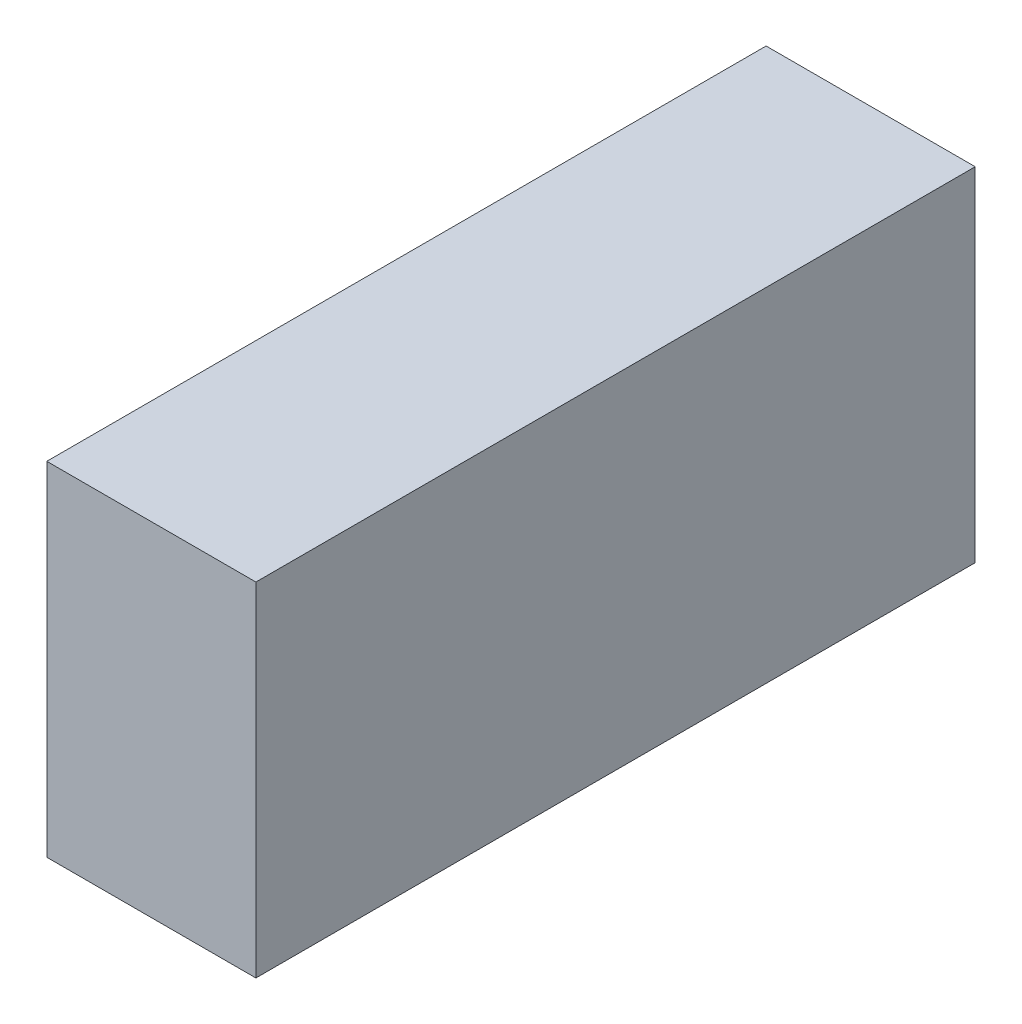
ISO-10303-21;
HEADER;
FILE_DESCRIPTION(('STEP AP214'),'2;1');
FILE_NAME('part.step','',(''),(''),'','','');
FILE_SCHEMA(('AUTOMOTIVE_DESIGN { 1 0 10303 214 1 1 1 1 }'));
ENDSEC;
DATA;
#1=APPLICATION_CONTEXT('core data for automotive mechanical design processes');
#2=APPLICATION_PROTOCOL_DEFINITION('international standard','automotive_design',2000,#1);
#3=PRODUCT_CONTEXT('',#1,'mechanical');
#4=PRODUCT('Part','Part','',(#3));
#5=PRODUCT_RELATED_PRODUCT_CATEGORY('part','',(#4));
#6=PRODUCT_DEFINITION_FORMATION('','',#4);
#7=PRODUCT_DEFINITION_CONTEXT('part definition',#1,'design');
#8=PRODUCT_DEFINITION('design','',#6,#7);
#9=PRODUCT_DEFINITION_SHAPE('','',#8);
#10=(LENGTH_UNIT() NAMED_UNIT(*) SI_UNIT(.MILLI.,.METRE.));
#11=(NAMED_UNIT(*) PLANE_ANGLE_UNIT() SI_UNIT($,.RADIAN.));
#12=(NAMED_UNIT(*) SI_UNIT($,.STERADIAN.) SOLID_ANGLE_UNIT());
#13=UNCERTAINTY_MEASURE_WITH_UNIT(LENGTH_MEASURE(1.E-05),#10,'distance_accuracy_value','');
#14=(GEOMETRIC_REPRESENTATION_CONTEXT(3) GLOBAL_UNCERTAINTY_ASSIGNED_CONTEXT((#13)) GLOBAL_UNIT_ASSIGNED_CONTEXT((#10,
#11,#12)) REPRESENTATION_CONTEXT('',''));
#15=CARTESIAN_POINT('',(0.,0.,0.));
#16=DIRECTION('',(0.,0.,1.));
#17=DIRECTION('',(1.,0.,0.));
#18=AXIS2_PLACEMENT_3D('',#15,#16,#17);
#19=CARTESIAN_POINT('',(0.,0.,43.));
#20=DIRECTION('',(1.,0.,0.));
#21=DIRECTION('',(0.,0.,-1.));
#22=AXIS2_PLACEMENT_3D('',#19,#20,#21);
#23=PLANE('',#22);
#24=DIRECTION('',(0.,-1.,0.));
#25=VECTOR('',#24,1.);
#26=CARTESIAN_POINT('',(0.,0.,0.));
#27=LINE('',#26,#25);
#28=CARTESIAN_POINT('',(0.,20.5,0.));
#29=VERTEX_POINT('',#28);
#30=CARTESIAN_POINT('',(0.,0.,0.));
#31=VERTEX_POINT('',#30);
#32=EDGE_CURVE('E100',#29,#31,#27,.T.);
#33=ORIENTED_EDGE('',*,*,#32,.T.);
#34=DIRECTION('',(0.,0.,-1.));
#35=VECTOR('',#34,1.);
#36=CARTESIAN_POINT('',(0.,0.,43.));
#37=LINE('',#36,#35);
#38=CARTESIAN_POINT('',(0.,0.,43.));
#39=VERTEX_POINT('',#38);
#40=EDGE_CURVE('E11',#39,#31,#37,.T.);
#41=ORIENTED_EDGE('',*,*,#40,.F.);
#42=DIRECTION('',(0.,-1.,0.));
#43=VECTOR('',#42,1.);
#44=CARTESIAN_POINT('',(0.,0.,43.));
#45=LINE('',#44,#43);
#46=CARTESIAN_POINT('',(0.,20.5,43.));
#47=VERTEX_POINT('',#46);
#48=EDGE_CURVE('E88',#47,#39,#45,.T.);
#49=ORIENTED_EDGE('',*,*,#48,.F.);
#50=DIRECTION('',(0.,0.,-1.));
#51=VECTOR('',#50,1.);
#52=CARTESIAN_POINT('',(0.,20.5,43.));
#53=LINE('',#52,#51);
#54=EDGE_CURVE('E96',#47,#29,#53,.T.);
#55=ORIENTED_EDGE('',*,*,#54,.T.);
#56=EDGE_LOOP('',(#33,#41,#49,#55));
#57=FACE_BOUND('',#56,.T.);
#58=ADVANCED_FACE('F37',(#57),#23,.F.);
#59=CARTESIAN_POINT('',(0.,0.,43.));
#60=DIRECTION('',(0.,1.,0.));
#61=DIRECTION('',(0.,0.,1.));
#62=AXIS2_PLACEMENT_3D('',#59,#60,#61);
#63=PLANE('',#62);
#64=DIRECTION('',(1.,0.,0.));
#65=VECTOR('',#64,1.);
#66=CARTESIAN_POINT('',(0.,0.,0.));
#67=LINE('',#66,#65);
#68=CARTESIAN_POINT('',(12.5,0.,0.));
#69=VERTEX_POINT('',#68);
#70=EDGE_CURVE('E92',#31,#69,#67,.T.);
#71=ORIENTED_EDGE('',*,*,#70,.T.);
#72=DIRECTION('',(0.,0.,-1.));
#73=VECTOR('',#72,1.);
#74=CARTESIAN_POINT('',(12.5,0.,43.));
#75=LINE('',#74,#73);
#76=CARTESIAN_POINT('',(12.5,0.,43.));
#77=VERTEX_POINT('',#76);
#78=EDGE_CURVE('E45',#77,#69,#75,.T.);
#79=ORIENTED_EDGE('',*,*,#78,.F.);
#80=DIRECTION('',(1.,0.,0.));
#81=VECTOR('',#80,1.);
#82=CARTESIAN_POINT('',(0.,0.,43.));
#83=LINE('',#82,#81);
#84=EDGE_CURVE('E83',#39,#77,#83,.T.);
#85=ORIENTED_EDGE('',*,*,#84,.F.);
#86=ORIENTED_EDGE('',*,*,#40,.T.);
#87=EDGE_LOOP('',(#71,#79,#85,#86));
#88=FACE_BOUND('',#87,.T.);
#89=ADVANCED_FACE('F91',(#88),#63,.F.);
#90=CARTESIAN_POINT('',(12.5,0.,43.));
#91=DIRECTION('',(-1.,0.,0.));
#92=DIRECTION('',(0.,0.,1.));
#93=AXIS2_PLACEMENT_3D('',#90,#91,#92);
#94=PLANE('',#93);
#95=DIRECTION('',(0.,1.,0.));
#96=VECTOR('',#95,1.);
#97=CARTESIAN_POINT('',(12.5,0.,0.));
#98=LINE('',#97,#96);
#99=CARTESIAN_POINT('',(12.5,20.5,0.));
#100=VERTEX_POINT('',#99);
#101=EDGE_CURVE('E70',#69,#100,#98,.T.);
#102=ORIENTED_EDGE('',*,*,#101,.T.);
#103=DIRECTION('',(0.,0.,-1.));
#104=VECTOR('',#103,1.);
#105=CARTESIAN_POINT('',(12.5,20.5,43.));
#106=LINE('',#105,#104);
#107=CARTESIAN_POINT('',(12.5,20.5,43.));
#108=VERTEX_POINT('',#107);
#109=EDGE_CURVE('E93',#108,#100,#106,.T.);
#110=ORIENTED_EDGE('',*,*,#109,.F.);
#111=DIRECTION('',(0.,1.,0.));
#112=VECTOR('',#111,1.);
#113=CARTESIAN_POINT('',(12.5,0.,43.));
#114=LINE('',#113,#112);
#115=EDGE_CURVE('E86',#77,#108,#114,.T.);
#116=ORIENTED_EDGE('',*,*,#115,.F.);
#117=ORIENTED_EDGE('',*,*,#78,.T.);
#118=EDGE_LOOP('',(#102,#110,#116,#117));
#119=FACE_BOUND('',#118,.T.);
#120=ADVANCED_FACE('F94',(#119),#94,.F.);
#121=CARTESIAN_POINT('',(0.,20.5,43.));
#122=DIRECTION('',(0.,-1.,0.));
#123=DIRECTION('',(0.,0.,-1.));
#124=AXIS2_PLACEMENT_3D('',#121,#122,#123);
#125=PLANE('',#124);
#126=DIRECTION('',(-1.,0.,0.));
#127=VECTOR('',#126,1.);
#128=CARTESIAN_POINT('',(0.,20.5,0.));
#129=LINE('',#128,#127);
#130=EDGE_CURVE('E76',#100,#29,#129,.T.);
#131=ORIENTED_EDGE('',*,*,#130,.T.);
#132=ORIENTED_EDGE('',*,*,#54,.F.);
#133=DIRECTION('',(-1.,0.,0.));
#134=VECTOR('',#133,1.);
#135=CARTESIAN_POINT('',(0.,20.5,43.));
#136=LINE('',#135,#134);
#137=EDGE_CURVE('E53',#108,#47,#136,.T.);
#138=ORIENTED_EDGE('',*,*,#137,.F.);
#139=ORIENTED_EDGE('',*,*,#109,.T.);
#140=EDGE_LOOP('',(#131,#132,#138,#139));
#141=FACE_BOUND('',#140,.T.);
#142=ADVANCED_FACE('F107',(#141),#125,.F.);
#143=CARTESIAN_POINT('',(0.,0.,43.));
#144=DIRECTION('',(0.,0.,-1.));
#145=DIRECTION('',(-1.,0.,0.));
#146=AXIS2_PLACEMENT_3D('',#143,#144,#145);
#147=PLANE('',#146);
#148=ORIENTED_EDGE('',*,*,#48,.T.);
#149=ORIENTED_EDGE('',*,*,#84,.T.);
#150=ORIENTED_EDGE('',*,*,#115,.T.);
#151=ORIENTED_EDGE('',*,*,#137,.T.);
#152=EDGE_LOOP('',(#148,#149,#150,#151));
#153=FACE_BOUND('',#152,.T.);
#154=ADVANCED_FACE('F84',(#153),#147,.F.);
#155=CARTESIAN_POINT('',(0.,0.,0.));
#156=DIRECTION('',(0.,0.,-1.));
#157=DIRECTION('',(-1.,0.,0.));
#158=AXIS2_PLACEMENT_3D('',#155,#156,#157);
#159=PLANE('',#158);
#160=ORIENTED_EDGE('',*,*,#32,.F.);
#161=ORIENTED_EDGE('',*,*,#130,.F.);
#162=ORIENTED_EDGE('',*,*,#101,.F.);
#163=ORIENTED_EDGE('',*,*,#70,.F.);
#164=EDGE_LOOP('',(#160,#161,#162,#163));
#165=FACE_BOUND('',#164,.T.);
#166=ADVANCED_FACE('F110',(#165),#159,.T.);
#167=CLOSED_SHELL('',(#58,#89,#120,#142,#154,#166));
#168=MANIFOLD_SOLID_BREP('B2',#167);
#169=ADVANCED_BREP_SHAPE_REPRESENTATION('',(#18,#168),#14);
#170=SHAPE_DEFINITION_REPRESENTATION(#9,#169);
ENDSEC;
END-ISO-10303-21;
